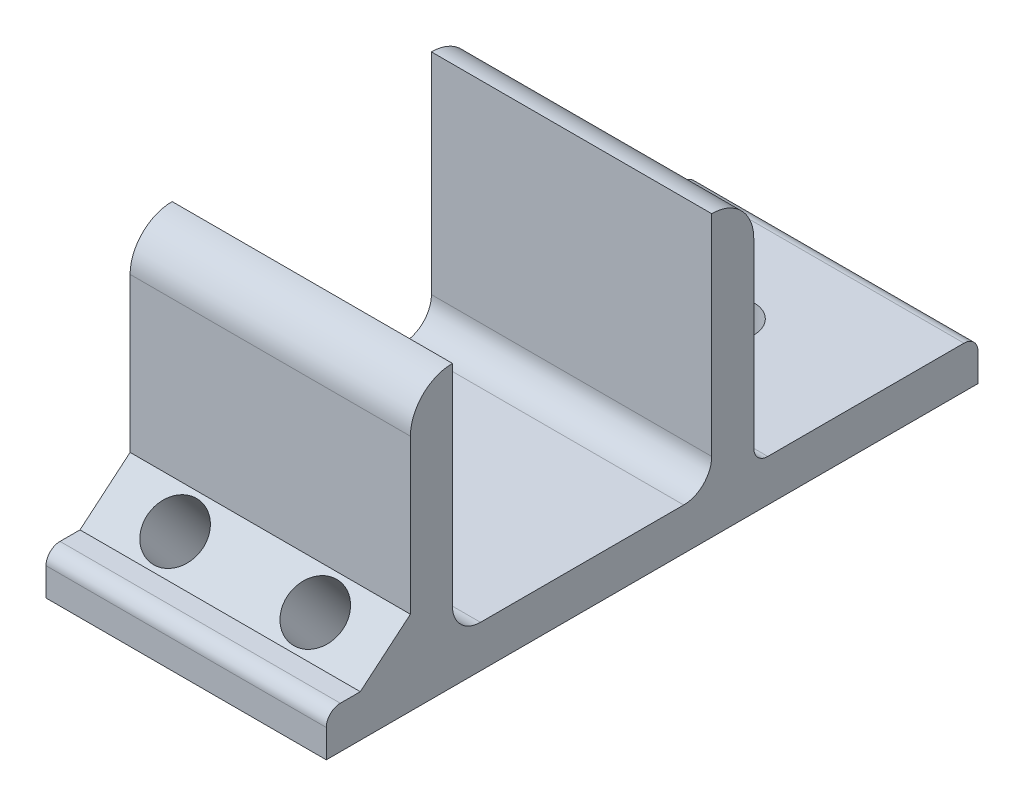
ISO-10303-21;
HEADER;
FILE_DESCRIPTION(('STEP AP214'),'2;1');
FILE_NAME('part.step','',(''),(''),'','','');
FILE_SCHEMA(('AUTOMOTIVE_DESIGN { 1 0 10303 214 1 1 1 1 }'));
ENDSEC;
DATA;
#1=APPLICATION_CONTEXT('core data for automotive mechanical design processes');
#2=APPLICATION_PROTOCOL_DEFINITION('international standard','automotive_design',2000,#1);
#3=PRODUCT_CONTEXT('',#1,'mechanical');
#4=PRODUCT('Part','Part','',(#3));
#5=PRODUCT_RELATED_PRODUCT_CATEGORY('part','',(#4));
#6=PRODUCT_DEFINITION_FORMATION('','',#4);
#7=PRODUCT_DEFINITION_CONTEXT('part definition',#1,'design');
#8=PRODUCT_DEFINITION('design','',#6,#7);
#9=PRODUCT_DEFINITION_SHAPE('','',#8);
#10=(LENGTH_UNIT() NAMED_UNIT(*) SI_UNIT(.MILLI.,.METRE.));
#11=(NAMED_UNIT(*) PLANE_ANGLE_UNIT() SI_UNIT($,.RADIAN.));
#12=(NAMED_UNIT(*) SI_UNIT($,.STERADIAN.) SOLID_ANGLE_UNIT());
#13=UNCERTAINTY_MEASURE_WITH_UNIT(LENGTH_MEASURE(1.E-05),#10,'distance_accuracy_value','');
#14=(GEOMETRIC_REPRESENTATION_CONTEXT(3) GLOBAL_UNCERTAINTY_ASSIGNED_CONTEXT((#13)) GLOBAL_UNIT_ASSIGNED_CONTEXT((#10,
#11,#12)) REPRESENTATION_CONTEXT('',''));
#15=CARTESIAN_POINT('',(0.,0.,0.));
#16=DIRECTION('',(0.,0.,1.));
#17=DIRECTION('',(1.,0.,0.));
#18=AXIS2_PLACEMENT_3D('',#15,#16,#17);
#19=CARTESIAN_POINT('',(20.,0.,18.25));
#20=DIRECTION('',(0.,0.,-1.));
#21=DIRECTION('',(0.,1.,0.));
#22=AXIS2_PLACEMENT_3D('',#19,#20,#21);
#23=PLANE('',#22);
#24=DIRECTION('',(0.,-1.,0.));
#25=VECTOR('',#24,1.);
#26=CARTESIAN_POINT('',(0.,0.,18.25));
#27=LINE('',#26,#25);
#28=CARTESIAN_POINT('',(0.,2.,18.25));
#29=VERTEX_POINT('',#28);
#30=CARTESIAN_POINT('',(0.,0.,18.25));
#31=VERTEX_POINT('',#30);
#32=EDGE_CURVE('E181',#29,#31,#27,.T.);
#33=ORIENTED_EDGE('',*,*,#32,.T.);
#34=DIRECTION('',(-1.,0.,0.));
#35=VECTOR('',#34,1.);
#36=CARTESIAN_POINT('',(20.,0.,18.25));
#37=LINE('',#36,#35);
#38=CARTESIAN_POINT('',(20.,0.,18.25));
#39=VERTEX_POINT('',#38);
#40=EDGE_CURVE('E162',#39,#31,#37,.T.);
#41=ORIENTED_EDGE('',*,*,#40,.F.);
#42=DIRECTION('',(0.,-1.,0.));
#43=VECTOR('',#42,1.);
#44=CARTESIAN_POINT('',(20.,0.,18.25));
#45=LINE('',#44,#43);
#46=CARTESIAN_POINT('',(20.,2.,18.25));
#47=VERTEX_POINT('',#46);
#48=EDGE_CURVE('E169',#47,#39,#45,.T.);
#49=ORIENTED_EDGE('',*,*,#48,.F.);
#50=DIRECTION('',(-1.,0.,0.));
#51=VECTOR('',#50,1.);
#52=CARTESIAN_POINT('',(20.,2.,18.25));
#53=LINE('',#52,#51);
#54=EDGE_CURVE('E227',#47,#29,#53,.T.);
#55=ORIENTED_EDGE('',*,*,#54,.T.);
#56=EDGE_LOOP('',(#33,#41,#49,#55));
#57=FACE_BOUND('',#56,.T.);
#58=ADVANCED_FACE('F33',(#57),#23,.F.);
#59=CARTESIAN_POINT('',(20.,0.,-18.25));
#60=DIRECTION('',(0.,1.,0.));
#61=DIRECTION('',(0.,0.,1.));
#62=AXIS2_PLACEMENT_3D('',#59,#60,#61);
#63=PLANE('',#62);
#64=CARTESIAN_POINT('',(10.,0.,-20.25));
#65=DIRECTION('',(0.,1.,0.));
#66=DIRECTION('',(0.,0.,1.));
#67=AXIS2_PLACEMENT_3D('',#64,#65,#66);
#68=CIRCLE('',#67,2.);
#69=CARTESIAN_POINT('',(10.,0.,-18.25));
#70=VERTEX_POINT('',#69);
#71=EDGE_CURVE('E409',#70,#70,#68,.T.);
#72=ORIENTED_EDGE('',*,*,#71,.T.);
#73=EDGE_LOOP('',(#72));
#74=FACE_BOUND('',#73,.T.);
#75=CARTESIAN_POINT('',(15.,0.,10.2616820485936));
#76=DIRECTION('',(0.,1.,0.));
#77=DIRECTION('',(0.,0.,1.));
#78=AXIS2_PLACEMENT_3D('',#75,#76,#77);
#79=ELLIPSE('',#78,2.61081457866455,2.);
#80=CARTESIAN_POINT('',(15.,0.,12.8724966272582));
#81=VERTEX_POINT('',#80);
#82=EDGE_CURVE('E413',#81,#81,#79,.T.);
#83=ORIENTED_EDGE('',*,*,#82,.T.);
#84=EDGE_LOOP('',(#83));
#85=FACE_BOUND('',#84,.T.);
#86=CARTESIAN_POINT('',(5.,0.,10.2616820485936));
#87=DIRECTION('',(0.,1.,0.));
#88=DIRECTION('',(0.,0.,1.));
#89=AXIS2_PLACEMENT_3D('',#86,#87,#88);
#90=ELLIPSE('',#89,2.61081457866455,2.);
#91=CARTESIAN_POINT('',(5.,0.,12.8724966272582));
#92=VERTEX_POINT('',#91);
#93=EDGE_CURVE('E302',#92,#92,#90,.T.);
#94=ORIENTED_EDGE('',*,*,#93,.T.);
#95=EDGE_LOOP('',(#94));
#96=FACE_BOUND('',#95,.T.);
#97=DIRECTION('',(0.,0.,-1.));
#98=VECTOR('',#97,1.);
#99=CARTESIAN_POINT('',(0.,0.,-18.25));
#100=LINE('',#99,#98);
#101=CARTESIAN_POINT('',(0.,0.,-28.25));
#102=VERTEX_POINT('',#101);
#103=EDGE_CURVE('E269',#31,#102,#100,.T.);
#104=ORIENTED_EDGE('',*,*,#103,.T.);
#105=DIRECTION('',(-1.,0.,0.));
#106=VECTOR('',#105,1.);
#107=CARTESIAN_POINT('',(20.,0.,-28.25));
#108=LINE('',#107,#106);
#109=CARTESIAN_POINT('',(20.,0.,-28.25));
#110=VERTEX_POINT('',#109);
#111=EDGE_CURVE('E165',#110,#102,#108,.T.);
#112=ORIENTED_EDGE('',*,*,#111,.F.);
#113=DIRECTION('',(0.,0.,-1.));
#114=VECTOR('',#113,1.);
#115=CARTESIAN_POINT('',(20.,0.,18.25));
#116=LINE('',#115,#114);
#117=EDGE_CURVE('E158',#39,#110,#116,.T.);
#118=ORIENTED_EDGE('',*,*,#117,.F.);
#119=ORIENTED_EDGE('',*,*,#40,.T.);
#120=EDGE_LOOP('',(#104,#112,#118,#119));
#121=FACE_BOUND('',#120,.T.);
#122=ADVANCED_FACE('F160',(#74,#85,#96,#121),#63,.F.);
#123=CARTESIAN_POINT('',(20.,0.,-28.25));
#124=DIRECTION('',(0.,0.,1.));
#125=DIRECTION('',(1.,0.,0.));
#126=AXIS2_PLACEMENT_3D('',#123,#124,#125);
#127=PLANE('',#126);
#128=DIRECTION('',(0.,1.,0.));
#129=VECTOR('',#128,1.);
#130=CARTESIAN_POINT('',(0.,0.,-28.25));
#131=LINE('',#130,#129);
#132=CARTESIAN_POINT('',(0.,2.,-28.25));
#133=VERTEX_POINT('',#132);
#134=EDGE_CURVE('E263',#102,#133,#131,.T.);
#135=ORIENTED_EDGE('',*,*,#134,.T.);
#136=DIRECTION('',(-1.,0.,0.));
#137=VECTOR('',#136,1.);
#138=CARTESIAN_POINT('',(20.,2.,-28.25));
#139=LINE('',#138,#137);
#140=CARTESIAN_POINT('',(20.,2.,-28.25));
#141=VERTEX_POINT('',#140);
#142=EDGE_CURVE('E187',#141,#133,#139,.T.);
#143=ORIENTED_EDGE('',*,*,#142,.F.);
#144=DIRECTION('',(0.,1.,0.));
#145=VECTOR('',#144,1.);
#146=CARTESIAN_POINT('',(20.,0.,-28.25));
#147=LINE('',#146,#145);
#148=EDGE_CURVE('E168',#110,#141,#147,.T.);
#149=ORIENTED_EDGE('',*,*,#148,.F.);
#150=ORIENTED_EDGE('',*,*,#111,.T.);
#151=EDGE_LOOP('',(#135,#143,#149,#150));
#152=FACE_BOUND('',#151,.T.);
#153=ADVANCED_FACE('F303',(#152),#127,.F.);
#154=CARTESIAN_POINT('',(20.,2.,-27.25));
#155=DIRECTION('',(-1.,0.,0.));
#156=DIRECTION('',(0.,0.,1.));
#157=AXIS2_PLACEMENT_3D('',#154,#155,#156);
#158=CYLINDRICAL_SURFACE('',#157,1.);
#159=CARTESIAN_POINT('',(0.,2.,-27.25));
#160=DIRECTION('',(1.,0.,0.));
#161=DIRECTION('',(0.,0.,-1.));
#162=AXIS2_PLACEMENT_3D('',#159,#160,#161);
#163=CIRCLE('',#162,1.);
#164=CARTESIAN_POINT('',(0.,3.,-27.25));
#165=VERTEX_POINT('',#164);
#166=EDGE_CURVE('E258',#133,#165,#163,.T.);
#167=ORIENTED_EDGE('',*,*,#166,.T.);
#168=DIRECTION('',(-1.,0.,0.));
#169=VECTOR('',#168,1.);
#170=CARTESIAN_POINT('',(20.,3.,-27.25));
#171=LINE('',#170,#169);
#172=CARTESIAN_POINT('',(20.,3.,-27.25));
#173=VERTEX_POINT('',#172);
#174=EDGE_CURVE('E249',#173,#165,#171,.T.);
#175=ORIENTED_EDGE('',*,*,#174,.F.);
#176=CARTESIAN_POINT('',(20.,2.,-27.25));
#177=DIRECTION('',(1.,0.,0.));
#178=DIRECTION('',(0.,0.,-1.));
#179=AXIS2_PLACEMENT_3D('',#176,#177,#178);
#180=CIRCLE('',#179,1.);
#181=EDGE_CURVE('E259',#141,#173,#180,.T.);
#182=ORIENTED_EDGE('',*,*,#181,.F.);
#183=ORIENTED_EDGE('',*,*,#142,.T.);
#184=EDGE_LOOP('',(#167,#175,#182,#183));
#185=FACE_BOUND('',#184,.T.);
#186=ADVANCED_FACE('F256',(#185),#158,.T.);
#187=CARTESIAN_POINT('',(20.,3.,-27.25));
#188=DIRECTION('',(0.,-1.,0.));
#189=DIRECTION('',(0.,0.,-1.));
#190=AXIS2_PLACEMENT_3D('',#187,#188,#189);
#191=PLANE('',#190);
#192=CARTESIAN_POINT('',(10.,3.,-20.25));
#193=DIRECTION('',(0.,1.,0.));
#194=DIRECTION('',(0.,0.,1.));
#195=AXIS2_PLACEMENT_3D('',#192,#193,#194);
#196=CIRCLE('',#195,2.);
#197=CARTESIAN_POINT('',(10.,3.,-18.25));
#198=VERTEX_POINT('',#197);
#199=EDGE_CURVE('E406',#198,#198,#196,.T.);
#200=ORIENTED_EDGE('',*,*,#199,.F.);
#201=EDGE_LOOP('',(#200));
#202=FACE_BOUND('',#201,.T.);
#203=DIRECTION('',(0.,0.,1.));
#204=VECTOR('',#203,1.);
#205=CARTESIAN_POINT('',(0.,3.,-27.25));
#206=LINE('',#205,#204);
#207=CARTESIAN_POINT('',(0.,3.,-13.25));
#208=VERTEX_POINT('',#207);
#209=EDGE_CURVE('E265',#165,#208,#206,.T.);
#210=ORIENTED_EDGE('',*,*,#209,.T.);
#211=DIRECTION('',(-1.,0.,0.));
#212=VECTOR('',#211,1.);
#213=CARTESIAN_POINT('',(20.,3.,-13.25));
#214=LINE('',#213,#212);
#215=CARTESIAN_POINT('',(20.,3.,-13.25));
#216=VERTEX_POINT('',#215);
#217=EDGE_CURVE('E246',#216,#208,#214,.T.);
#218=ORIENTED_EDGE('',*,*,#217,.F.);
#219=DIRECTION('',(0.,0.,1.));
#220=VECTOR('',#219,1.);
#221=CARTESIAN_POINT('',(20.,3.,-27.25));
#222=LINE('',#221,#220);
#223=EDGE_CURVE('E305',#173,#216,#222,.T.);
#224=ORIENTED_EDGE('',*,*,#223,.F.);
#225=ORIENTED_EDGE('',*,*,#174,.T.);
#226=EDGE_LOOP('',(#210,#218,#224,#225));
#227=FACE_BOUND('',#226,.T.);
#228=ADVANCED_FACE('F354',(#202,#227),#191,.F.);
#229=CARTESIAN_POINT('',(20.,4.,-13.25));
#230=DIRECTION('',(-1.,0.,0.));
#231=DIRECTION('',(0.,0.,1.));
#232=AXIS2_PLACEMENT_3D('',#229,#230,#231);
#233=CYLINDRICAL_SURFACE('',#232,1.);
#234=CARTESIAN_POINT('',(0.,4.,-13.25));
#235=DIRECTION('',(-1.,0.,0.));
#236=DIRECTION('',(0.,0.,-1.));
#237=AXIS2_PLACEMENT_3D('',#234,#235,#236);
#238=CIRCLE('',#237,1.);
#239=CARTESIAN_POINT('',(0.,4.,-12.25));
#240=VERTEX_POINT('',#239);
#241=EDGE_CURVE('E267',#208,#240,#238,.T.);
#242=ORIENTED_EDGE('',*,*,#241,.T.);
#243=DIRECTION('',(-1.,0.,0.));
#244=VECTOR('',#243,1.);
#245=CARTESIAN_POINT('',(20.,4.,-12.25));
#246=LINE('',#245,#244);
#247=CARTESIAN_POINT('',(20.,4.,-12.25));
#248=VERTEX_POINT('',#247);
#249=EDGE_CURVE('E243',#248,#240,#246,.T.);
#250=ORIENTED_EDGE('',*,*,#249,.F.);
#251=CARTESIAN_POINT('',(20.,4.,-13.25));
#252=DIRECTION('',(-1.,0.,0.));
#253=DIRECTION('',(0.,0.,-1.));
#254=AXIS2_PLACEMENT_3D('',#251,#252,#253);
#255=CIRCLE('',#254,1.);
#256=EDGE_CURVE('E309',#216,#248,#255,.T.);
#257=ORIENTED_EDGE('',*,*,#256,.F.);
#258=ORIENTED_EDGE('',*,*,#217,.T.);
#259=EDGE_LOOP('',(#242,#250,#257,#258));
#260=FACE_BOUND('',#259,.T.);
#261=ADVANCED_FACE('F357',(#260),#233,.F.);
#262=CARTESIAN_POINT('',(20.,17.,-12.25));
#263=DIRECTION('',(0.,0.,1.));
#264=DIRECTION('',(0.,-1.,0.));
#265=AXIS2_PLACEMENT_3D('',#262,#263,#264);
#266=PLANE('',#265);
#267=DIRECTION('',(0.,1.,0.));
#268=VECTOR('',#267,1.);
#269=CARTESIAN_POINT('',(0.,17.,-12.25));
#270=LINE('',#269,#268);
#271=CARTESIAN_POINT('',(0.,17.,-12.25));
#272=VERTEX_POINT('',#271);
#273=EDGE_CURVE('E274',#240,#272,#270,.T.);
#274=ORIENTED_EDGE('',*,*,#273,.T.);
#275=DIRECTION('',(-1.,0.,0.));
#276=VECTOR('',#275,1.);
#277=CARTESIAN_POINT('',(20.,17.,-12.25));
#278=LINE('',#277,#276);
#279=CARTESIAN_POINT('',(20.,17.,-12.25));
#280=VERTEX_POINT('',#279);
#281=EDGE_CURVE('E240',#280,#272,#278,.T.);
#282=ORIENTED_EDGE('',*,*,#281,.F.);
#283=DIRECTION('',(0.,1.,0.));
#284=VECTOR('',#283,1.);
#285=CARTESIAN_POINT('',(20.,17.,-12.25));
#286=LINE('',#285,#284);
#287=EDGE_CURVE('E311',#248,#280,#286,.T.);
#288=ORIENTED_EDGE('',*,*,#287,.F.);
#289=ORIENTED_EDGE('',*,*,#249,.T.);
#290=EDGE_LOOP('',(#274,#282,#288,#289));
#291=FACE_BOUND('',#290,.T.);
#292=ADVANCED_FACE('F361',(#291),#266,.F.);
#293=CARTESIAN_POINT('',(20.,17.,-9.25));
#294=DIRECTION('',(-1.,0.,0.));
#295=DIRECTION('',(0.,0.,1.));
#296=AXIS2_PLACEMENT_3D('',#293,#294,#295);
#297=CYLINDRICAL_SURFACE('',#296,3.);
#298=CARTESIAN_POINT('',(0.,17.,-9.25));
#299=DIRECTION('',(1.,0.,0.));
#300=DIRECTION('',(0.,0.,1.));
#301=AXIS2_PLACEMENT_3D('',#298,#299,#300);
#302=CIRCLE('',#301,3.);
#303=CARTESIAN_POINT('',(0.,20.,-9.25));
#304=VERTEX_POINT('',#303);
#305=EDGE_CURVE('E276',#272,#304,#302,.T.);
#306=ORIENTED_EDGE('',*,*,#305,.T.);
#307=DIRECTION('',(-1.,0.,0.));
#308=VECTOR('',#307,1.);
#309=CARTESIAN_POINT('',(20.,20.,-9.25));
#310=LINE('',#309,#308);
#311=CARTESIAN_POINT('',(20.,20.,-9.25));
#312=VERTEX_POINT('',#311);
#313=EDGE_CURVE('E237',#312,#304,#310,.T.);
#314=ORIENTED_EDGE('',*,*,#313,.F.);
#315=CARTESIAN_POINT('',(20.,17.,-9.25));
#316=DIRECTION('',(1.,0.,0.));
#317=DIRECTION('',(0.,0.,1.));
#318=AXIS2_PLACEMENT_3D('',#315,#316,#317);
#319=CIRCLE('',#318,3.);
#320=EDGE_CURVE('E313',#280,#312,#319,.T.);
#321=ORIENTED_EDGE('',*,*,#320,.F.);
#322=ORIENTED_EDGE('',*,*,#281,.T.);
#323=EDGE_LOOP('',(#306,#314,#321,#322));
#324=FACE_BOUND('',#323,.T.);
#325=ADVANCED_FACE('F365',(#324),#297,.T.);
#326=CARTESIAN_POINT('',(20.,3.,-9.25000000000001));
#327=DIRECTION('',(0.,0.,-1.));
#328=DIRECTION('',(0.,1.,0.));
#329=AXIS2_PLACEMENT_3D('',#326,#327,#328);
#330=PLANE('',#329);
#331=DIRECTION('',(0.,-1.,0.));
#332=VECTOR('',#331,1.);
#333=CARTESIAN_POINT('',(0.,3.,-9.25000000000001));
#334=LINE('',#333,#332);
#335=CARTESIAN_POINT('',(0.,5.,-9.25000000000001));
#336=VERTEX_POINT('',#335);
#337=EDGE_CURVE('E278',#304,#336,#334,.T.);
#338=ORIENTED_EDGE('',*,*,#337,.T.);
#339=DIRECTION('',(-1.,0.,0.));
#340=VECTOR('',#339,1.);
#341=CARTESIAN_POINT('',(20.,5.,-9.25000000000001));
#342=LINE('',#341,#340);
#343=CARTESIAN_POINT('',(20.,5.,-9.25000000000001));
#344=VERTEX_POINT('',#343);
#345=EDGE_CURVE('E195',#336,#344,#342,.F.);
#346=ORIENTED_EDGE('',*,*,#345,.T.);
#347=DIRECTION('',(0.,-1.,0.));
#348=VECTOR('',#347,1.);
#349=CARTESIAN_POINT('',(20.,3.,-9.25000000000001));
#350=LINE('',#349,#348);
#351=EDGE_CURVE('E315',#312,#344,#350,.T.);
#352=ORIENTED_EDGE('',*,*,#351,.F.);
#353=ORIENTED_EDGE('',*,*,#313,.T.);
#354=EDGE_LOOP('',(#338,#346,#352,#353));
#355=FACE_BOUND('',#354,.T.);
#356=ADVANCED_FACE('F369',(#355),#330,.F.);
#357=CARTESIAN_POINT('',(20.,3.,-9.25000000000001));
#358=DIRECTION('',(0.,-1.,0.));
#359=DIRECTION('',(0.,0.,-1.));
#360=AXIS2_PLACEMENT_3D('',#357,#358,#359);
#361=PLANE('',#360);
#362=DIRECTION('',(0.,0.,1.));
#363=VECTOR('',#362,1.);
#364=CARTESIAN_POINT('',(0.,3.,-9.25000000000001));
#365=LINE('',#364,#363);
#366=CARTESIAN_POINT('',(0.,3.,-7.25000000000001));
#367=VERTEX_POINT('',#366);
#368=CARTESIAN_POINT('',(0.,3.,7.25));
#369=VERTEX_POINT('',#368);
#370=EDGE_CURVE('E281',#367,#369,#365,.T.);
#371=ORIENTED_EDGE('',*,*,#370,.T.);
#372=DIRECTION('',(-1.,0.,0.));
#373=VECTOR('',#372,1.);
#374=CARTESIAN_POINT('',(20.,3.,7.25));
#375=LINE('',#374,#373);
#376=CARTESIAN_POINT('',(20.,3.,7.25));
#377=VERTEX_POINT('',#376);
#378=EDGE_CURVE('E193',#369,#377,#375,.F.);
#379=ORIENTED_EDGE('',*,*,#378,.T.);
#380=DIRECTION('',(0.,0.,1.));
#381=VECTOR('',#380,1.);
#382=CARTESIAN_POINT('',(20.,3.,-9.25000000000001));
#383=LINE('',#382,#381);
#384=CARTESIAN_POINT('',(20.,3.,-7.25000000000001));
#385=VERTEX_POINT('',#384);
#386=EDGE_CURVE('E318',#385,#377,#383,.T.);
#387=ORIENTED_EDGE('',*,*,#386,.F.);
#388=DIRECTION('',(-1.,0.,0.));
#389=VECTOR('',#388,1.);
#390=CARTESIAN_POINT('',(0.,3.,-7.25000000000001));
#391=LINE('',#390,#389);
#392=EDGE_CURVE('E185',#385,#367,#391,.T.);
#393=ORIENTED_EDGE('',*,*,#392,.T.);
#394=EDGE_LOOP('',(#371,#379,#387,#393));
#395=FACE_BOUND('',#394,.T.);
#396=ADVANCED_FACE('F329',(#395),#361,.F.);
#397=CARTESIAN_POINT('',(20.,3.,9.25));
#398=DIRECTION('',(0.,0.,1.));
#399=DIRECTION('',(0.,-1.,0.));
#400=AXIS2_PLACEMENT_3D('',#397,#398,#399);
#401=PLANE('',#400);
#402=DIRECTION('',(0.,1.,0.));
#403=VECTOR('',#402,1.);
#404=CARTESIAN_POINT('',(20.,3.,9.25));
#405=LINE('',#404,#403);
#406=CARTESIAN_POINT('',(20.,5.,9.25));
#407=VERTEX_POINT('',#406);
#408=CARTESIAN_POINT('',(20.,20.,9.25));
#409=VERTEX_POINT('',#408);
#410=EDGE_CURVE('E297',#407,#409,#405,.T.);
#411=ORIENTED_EDGE('',*,*,#410,.F.);
#412=DIRECTION('',(-1.,0.,0.));
#413=VECTOR('',#412,1.);
#414=CARTESIAN_POINT('',(0.,5.,9.25));
#415=LINE('',#414,#413);
#416=CARTESIAN_POINT('',(0.,5.,9.25));
#417=VERTEX_POINT('',#416);
#418=EDGE_CURVE('E182',#407,#417,#415,.T.);
#419=ORIENTED_EDGE('',*,*,#418,.T.);
#420=DIRECTION('',(0.,1.,0.));
#421=VECTOR('',#420,1.);
#422=CARTESIAN_POINT('',(0.,3.,9.25));
#423=LINE('',#422,#421);
#424=CARTESIAN_POINT('',(0.,20.,9.25));
#425=VERTEX_POINT('',#424);
#426=EDGE_CURVE('E284',#417,#425,#423,.T.);
#427=ORIENTED_EDGE('',*,*,#426,.T.);
#428=DIRECTION('',(-1.,0.,0.));
#429=VECTOR('',#428,1.);
#430=CARTESIAN_POINT('',(20.,20.,9.25));
#431=LINE('',#430,#429);
#432=EDGE_CURVE('E234',#409,#425,#431,.T.);
#433=ORIENTED_EDGE('',*,*,#432,.F.);
#434=EDGE_LOOP('',(#411,#419,#427,#433));
#435=FACE_BOUND('',#434,.T.);
#436=ADVANCED_FACE('F324',(#435),#401,.F.);
#437=CARTESIAN_POINT('',(20.,17.,9.25));
#438=DIRECTION('',(-1.,0.,0.));
#439=DIRECTION('',(0.,0.,1.));
#440=AXIS2_PLACEMENT_3D('',#437,#438,#439);
#441=CYLINDRICAL_SURFACE('',#440,3.);
#442=CARTESIAN_POINT('',(0.,17.,9.25));
#443=DIRECTION('',(1.,0.,0.));
#444=DIRECTION('',(0.,0.,-1.));
#445=AXIS2_PLACEMENT_3D('',#442,#443,#444);
#446=CIRCLE('',#445,3.);
#447=CARTESIAN_POINT('',(0.,17.,12.25));
#448=VERTEX_POINT('',#447);
#449=EDGE_CURVE('E223',#425,#448,#446,.T.);
#450=ORIENTED_EDGE('',*,*,#449,.T.);
#451=DIRECTION('',(-1.,0.,0.));
#452=VECTOR('',#451,1.);
#453=CARTESIAN_POINT('',(20.,17.,12.25));
#454=LINE('',#453,#452);
#455=CARTESIAN_POINT('',(20.,17.,12.25));
#456=VERTEX_POINT('',#455);
#457=EDGE_CURVE('E231',#456,#448,#454,.T.);
#458=ORIENTED_EDGE('',*,*,#457,.F.);
#459=CARTESIAN_POINT('',(20.,17.,9.25));
#460=DIRECTION('',(1.,0.,0.));
#461=DIRECTION('',(0.,0.,-1.));
#462=AXIS2_PLACEMENT_3D('',#459,#460,#461);
#463=CIRCLE('',#462,3.);
#464=EDGE_CURVE('E294',#409,#456,#463,.T.);
#465=ORIENTED_EDGE('',*,*,#464,.F.);
#466=ORIENTED_EDGE('',*,*,#432,.T.);
#467=EDGE_LOOP('',(#450,#458,#465,#466));
#468=FACE_BOUND('',#467,.T.);
#469=ADVANCED_FACE('F288',(#468),#441,.T.);
#470=CARTESIAN_POINT('',(20.,17.,12.25));
#471=DIRECTION('',(0.,0.,-1.));
#472=DIRECTION('',(0.,1.,0.));
#473=AXIS2_PLACEMENT_3D('',#470,#471,#472);
#474=PLANE('',#473);
#475=DIRECTION('',(0.,-1.,0.));
#476=VECTOR('',#475,1.);
#477=CARTESIAN_POINT('',(0.,17.,12.25));
#478=LINE('',#477,#476);
#479=CARTESIAN_POINT('',(0.,5.99999999999999,12.25));
#480=VERTEX_POINT('',#479);
#481=EDGE_CURVE('E220',#448,#480,#478,.T.);
#482=ORIENTED_EDGE('',*,*,#481,.T.);
#483=DIRECTION('',(1.,0.,0.));
#484=VECTOR('',#483,1.);
#485=CARTESIAN_POINT('',(20.,5.99999999999999,12.25));
#486=LINE('',#485,#484);
#487=CARTESIAN_POINT('',(20.,5.99999999999999,12.25));
#488=VERTEX_POINT('',#487);
#489=EDGE_CURVE('E48',#480,#488,#486,.T.);
#490=ORIENTED_EDGE('',*,*,#489,.T.);
#491=DIRECTION('',(0.,-1.,0.));
#492=VECTOR('',#491,1.);
#493=CARTESIAN_POINT('',(20.,17.,12.25));
#494=LINE('',#493,#492);
#495=EDGE_CURVE('E293',#456,#488,#494,.T.);
#496=ORIENTED_EDGE('',*,*,#495,.F.);
#497=ORIENTED_EDGE('',*,*,#457,.T.);
#498=EDGE_LOOP('',(#482,#490,#496,#497));
#499=FACE_BOUND('',#498,.T.);
#500=ADVANCED_FACE('F292',(#499),#474,.F.);
#501=CARTESIAN_POINT('',(20.,3.,17.25));
#502=DIRECTION('',(0.,-1.,0.));
#503=DIRECTION('',(0.,0.,-1.));
#504=AXIS2_PLACEMENT_3D('',#501,#502,#503);
#505=PLANE('',#504);
#506=DIRECTION('',(0.,0.,1.));
#507=VECTOR('',#506,1.);
#508=CARTESIAN_POINT('',(20.,3.,17.25));
#509=LINE('',#508,#507);
#510=CARTESIAN_POINT('',(20.,3.,15.8252607777827));
#511=VERTEX_POINT('',#510);
#512=CARTESIAN_POINT('',(20.,3.,17.25));
#513=VERTEX_POINT('',#512);
#514=EDGE_CURVE('E215',#511,#513,#509,.T.);
#515=ORIENTED_EDGE('',*,*,#514,.F.);
#516=DIRECTION('',(-1.,0.,0.));
#517=VECTOR('',#516,1.);
#518=CARTESIAN_POINT('',(0.,3.,15.8252607777827));
#519=LINE('',#518,#517);
#520=CARTESIAN_POINT('',(0.,3.,15.8252607777827));
#521=VERTEX_POINT('',#520);
#522=EDGE_CURVE('E205',#511,#521,#519,.T.);
#523=ORIENTED_EDGE('',*,*,#522,.T.);
#524=DIRECTION('',(0.,0.,1.));
#525=VECTOR('',#524,1.);
#526=CARTESIAN_POINT('',(0.,3.,17.25));
#527=LINE('',#526,#525);
#528=CARTESIAN_POINT('',(0.,3.,17.25));
#529=VERTEX_POINT('',#528);
#530=EDGE_CURVE('E213',#521,#529,#527,.T.);
#531=ORIENTED_EDGE('',*,*,#530,.T.);
#532=DIRECTION('',(-1.,0.,0.));
#533=VECTOR('',#532,1.);
#534=CARTESIAN_POINT('',(20.,3.,17.25));
#535=LINE('',#534,#533);
#536=EDGE_CURVE('E229',#513,#529,#535,.T.);
#537=ORIENTED_EDGE('',*,*,#536,.F.);
#538=EDGE_LOOP('',(#515,#523,#531,#537));
#539=FACE_BOUND('',#538,.T.);
#540=ADVANCED_FACE('F211',(#539),#505,.F.);
#541=CARTESIAN_POINT('',(20.,2.,17.25));
#542=DIRECTION('',(-1.,0.,0.));
#543=DIRECTION('',(0.,0.,1.));
#544=AXIS2_PLACEMENT_3D('',#541,#542,#543);
#545=CYLINDRICAL_SURFACE('',#544,0.999999999999999);
#546=CARTESIAN_POINT('',(0.,2.,17.25));
#547=DIRECTION('',(1.,0.,0.));
#548=DIRECTION('',(0.,0.,1.));
#549=AXIS2_PLACEMENT_3D('',#546,#547,#548);
#550=CIRCLE('',#549,0.999999999999999);
#551=EDGE_CURVE('E178',#529,#29,#550,.T.);
#552=ORIENTED_EDGE('',*,*,#551,.T.);
#553=ORIENTED_EDGE('',*,*,#54,.F.);
#554=CARTESIAN_POINT('',(20.,2.,17.25));
#555=DIRECTION('',(1.,0.,0.));
#556=DIRECTION('',(0.,0.,1.));
#557=AXIS2_PLACEMENT_3D('',#554,#555,#556);
#558=CIRCLE('',#557,0.999999999999999);
#559=EDGE_CURVE('E174',#513,#47,#558,.T.);
#560=ORIENTED_EDGE('',*,*,#559,.F.);
#561=ORIENTED_EDGE('',*,*,#536,.T.);
#562=EDGE_LOOP('',(#552,#553,#560,#561));
#563=FACE_BOUND('',#562,.T.);
#564=ADVANCED_FACE('F384',(#563),#545,.T.);
#565=CARTESIAN_POINT('',(20.,2.,17.25));
#566=DIRECTION('',(-1.,0.,0.));
#567=DIRECTION('',(0.,0.,1.));
#568=AXIS2_PLACEMENT_3D('',#565,#566,#567);
#569=PLANE('',#568);
#570=ORIENTED_EDGE('',*,*,#48,.T.);
#571=ORIENTED_EDGE('',*,*,#117,.T.);
#572=ORIENTED_EDGE('',*,*,#148,.T.);
#573=ORIENTED_EDGE('',*,*,#181,.T.);
#574=ORIENTED_EDGE('',*,*,#223,.T.);
#575=ORIENTED_EDGE('',*,*,#256,.T.);
#576=ORIENTED_EDGE('',*,*,#287,.T.);
#577=ORIENTED_EDGE('',*,*,#320,.T.);
#578=ORIENTED_EDGE('',*,*,#351,.T.);
#579=CARTESIAN_POINT('',(20.,5.,-7.25000000000001));
#580=DIRECTION('',(-1.,0.,0.));
#581=DIRECTION('',(0.,0.,1.));
#582=AXIS2_PLACEMENT_3D('',#579,#580,#581);
#583=CIRCLE('',#582,2.);
#584=EDGE_CURVE('E203',#344,#385,#583,.T.);
#585=ORIENTED_EDGE('',*,*,#584,.T.);
#586=ORIENTED_EDGE('',*,*,#386,.T.);
#587=CARTESIAN_POINT('',(20.,5.,7.25));
#588=DIRECTION('',(-1.,0.,0.));
#589=DIRECTION('',(0.,0.,1.));
#590=AXIS2_PLACEMENT_3D('',#587,#588,#589);
#591=CIRCLE('',#590,2.);
#592=EDGE_CURVE('E199',#377,#407,#591,.T.);
#593=ORIENTED_EDGE('',*,*,#592,.T.);
#594=ORIENTED_EDGE('',*,*,#410,.T.);
#595=ORIENTED_EDGE('',*,*,#464,.T.);
#596=ORIENTED_EDGE('',*,*,#495,.T.);
#597=DIRECTION('',(0.,0.642787609686535,-0.766044443118982));
#598=VECTOR('',#597,1.);
#599=CARTESIAN_POINT('',(20.,1.88527697280337,17.1537359501918));
#600=LINE('',#599,#598);
#601=EDGE_CURVE('E11',#488,#511,#600,.F.);
#602=ORIENTED_EDGE('',*,*,#601,.T.);
#603=ORIENTED_EDGE('',*,*,#514,.T.);
#604=ORIENTED_EDGE('',*,*,#559,.T.);
#605=EDGE_LOOP('',(#570,#571,#572,#573,#574,#575,#576,#577,#578,#585,#586,#593,#594,#595,#596,
#602,#603,#604));
#606=FACE_BOUND('',#605,.T.);
#607=ADVANCED_FACE('F172',(#606),#569,.F.);
#608=CARTESIAN_POINT('',(0.,2.,17.25));
#609=DIRECTION('',(-1.,0.,0.));
#610=DIRECTION('',(0.,0.,1.));
#611=AXIS2_PLACEMENT_3D('',#608,#609,#610);
#612=PLANE('',#611);
#613=ORIENTED_EDGE('',*,*,#32,.F.);
#614=ORIENTED_EDGE('',*,*,#551,.F.);
#615=ORIENTED_EDGE('',*,*,#530,.F.);
#616=DIRECTION('',(0.,-0.642787609686535,0.766044443118982));
#617=VECTOR('',#616,1.);
#618=CARTESIAN_POINT('',(0.,3.,15.8252607777827));
#619=LINE('',#618,#617);
#620=EDGE_CURVE('E41',#521,#480,#619,.F.);
#621=ORIENTED_EDGE('',*,*,#620,.T.);
#622=ORIENTED_EDGE('',*,*,#481,.F.);
#623=ORIENTED_EDGE('',*,*,#449,.F.);
#624=ORIENTED_EDGE('',*,*,#426,.F.);
#625=CARTESIAN_POINT('',(0.,5.,7.25));
#626=DIRECTION('',(-1.,0.,0.));
#627=DIRECTION('',(0.,0.,1.));
#628=AXIS2_PLACEMENT_3D('',#625,#626,#627);
#629=CIRCLE('',#628,2.);
#630=EDGE_CURVE('E197',#417,#369,#629,.F.);
#631=ORIENTED_EDGE('',*,*,#630,.T.);
#632=ORIENTED_EDGE('',*,*,#370,.F.);
#633=CARTESIAN_POINT('',(0.,5.,-7.25000000000001));
#634=DIRECTION('',(-1.,0.,0.));
#635=DIRECTION('',(0.,0.,1.));
#636=AXIS2_PLACEMENT_3D('',#633,#634,#635);
#637=CIRCLE('',#636,2.);
#638=EDGE_CURVE('E201',#367,#336,#637,.F.);
#639=ORIENTED_EDGE('',*,*,#638,.T.);
#640=ORIENTED_EDGE('',*,*,#337,.F.);
#641=ORIENTED_EDGE('',*,*,#305,.F.);
#642=ORIENTED_EDGE('',*,*,#273,.F.);
#643=ORIENTED_EDGE('',*,*,#241,.F.);
#644=ORIENTED_EDGE('',*,*,#209,.F.);
#645=ORIENTED_EDGE('',*,*,#166,.F.);
#646=ORIENTED_EDGE('',*,*,#134,.F.);
#647=ORIENTED_EDGE('',*,*,#103,.F.);
#648=EDGE_LOOP('',(#613,#614,#615,#621,#622,#623,#624,#631,#632,#639,#640,#641,#642,#643,#644,
#645,#646,#647));
#649=FACE_BOUND('',#648,.T.);
#650=ADVANCED_FACE('F219',(#649),#612,.T.);
#651=CARTESIAN_POINT('',(20.,5.,7.25));
#652=DIRECTION('',(1.,0.,0.));
#653=DIRECTION('',(0.,0.,-1.));
#654=AXIS2_PLACEMENT_3D('',#651,#652,#653);
#655=CYLINDRICAL_SURFACE('',#654,2.);
#656=ORIENTED_EDGE('',*,*,#592,.F.);
#657=ORIENTED_EDGE('',*,*,#378,.F.);
#658=ORIENTED_EDGE('',*,*,#630,.F.);
#659=ORIENTED_EDGE('',*,*,#418,.F.);
#660=EDGE_LOOP('',(#656,#657,#658,#659));
#661=FACE_BOUND('',#660,.T.);
#662=ADVANCED_FACE('F332',(#661),#655,.F.);
#663=CARTESIAN_POINT('',(20.,5.,-7.25000000000001));
#664=DIRECTION('',(1.,0.,0.));
#665=DIRECTION('',(0.,0.,-1.));
#666=AXIS2_PLACEMENT_3D('',#663,#664,#665);
#667=CYLINDRICAL_SURFACE('',#666,2.);
#668=ORIENTED_EDGE('',*,*,#584,.F.);
#669=ORIENTED_EDGE('',*,*,#345,.F.);
#670=ORIENTED_EDGE('',*,*,#638,.F.);
#671=ORIENTED_EDGE('',*,*,#392,.F.);
#672=EDGE_LOOP('',(#668,#669,#670,#671));
#673=FACE_BOUND('',#672,.T.);
#674=ADVANCED_FACE('F334',(#673),#667,.F.);
#675=CARTESIAN_POINT('',(20.,3.,15.8252607777827));
#676=DIRECTION('',(0.,0.766044443118982,0.642787609686535));
#677=DIRECTION('',(1.,0.,0.));
#678=AXIS2_PLACEMENT_3D('',#675,#676,#677);
#679=PLANE('',#678);
#680=CARTESIAN_POINT('',(15.,4.5,14.0376303888913));
#681=DIRECTION('',(0.,0.766044443118982,0.642787609686535));
#682=DIRECTION('',(0.,0.642787609686535,-0.766044443118982));
#683=AXIS2_PLACEMENT_3D('',#680,#681,#682);
#684=CIRCLE('',#683,2.);
#685=CARTESIAN_POINT('',(15.,5.78557521937307,12.5055415026534));
#686=VERTEX_POINT('',#685);
#687=EDGE_CURVE('E410',#686,#686,#684,.T.);
#688=ORIENTED_EDGE('',*,*,#687,.F.);
#689=EDGE_LOOP('',(#688));
#690=FACE_BOUND('',#689,.T.);
#691=CARTESIAN_POINT('',(5.,4.49999999999999,14.0376303888913));
#692=DIRECTION('',(0.,0.766044443118982,0.642787609686535));
#693=DIRECTION('',(0.,-0.642787609686535,0.766044443118982));
#694=AXIS2_PLACEMENT_3D('',#691,#692,#693);
#695=CIRCLE('',#694,2.);
#696=CARTESIAN_POINT('',(5.,3.21442478062692,15.5697192751293));
#697=VERTEX_POINT('',#696);
#698=EDGE_CURVE('E419',#697,#697,#695,.T.);
#699=ORIENTED_EDGE('',*,*,#698,.F.);
#700=EDGE_LOOP('',(#699));
#701=FACE_BOUND('',#700,.T.);
#702=ORIENTED_EDGE('',*,*,#601,.F.);
#703=ORIENTED_EDGE('',*,*,#489,.F.);
#704=ORIENTED_EDGE('',*,*,#620,.F.);
#705=ORIENTED_EDGE('',*,*,#522,.F.);
#706=EDGE_LOOP('',(#702,#703,#704,#705));
#707=FACE_BOUND('',#706,.T.);
#708=ADVANCED_FACE('F35',(#690,#701,#707),#679,.T.);
#709=CARTESIAN_POINT('',(5.,-18.963301531498,-5.65041727238973));
#710=DIRECTION('',(0.,0.766044443118982,0.642787609686535));
#711=DIRECTION('',(0.,-0.642787609686535,0.766044443118982));
#712=AXIS2_PLACEMENT_3D('',#709,#710,#711);
#713=CYLINDRICAL_SURFACE('',#712,2.);
#714=ORIENTED_EDGE('',*,*,#698,.T.);
#715=EDGE_LOOP('',(#714));
#716=FACE_BOUND('',#715,.T.);
#717=ORIENTED_EDGE('',*,*,#93,.F.);
#718=EDGE_LOOP('',(#717));
#719=FACE_BOUND('',#718,.T.);
#720=ADVANCED_FACE('F390',(#716,#719),#713,.F.);
#721=CARTESIAN_POINT('',(15.,-18.963301531498,-5.65041727238973));
#722=DIRECTION('',(0.,0.766044443118982,0.642787609686535));
#723=DIRECTION('',(0.,-0.642787609686535,0.766044443118982));
#724=AXIS2_PLACEMENT_3D('',#721,#722,#723);
#725=CYLINDRICAL_SURFACE('',#724,2.);
#726=ORIENTED_EDGE('',*,*,#687,.T.);
#727=EDGE_LOOP('',(#726));
#728=FACE_BOUND('',#727,.T.);
#729=ORIENTED_EDGE('',*,*,#82,.F.);
#730=EDGE_LOOP('',(#729));
#731=FACE_BOUND('',#730,.T.);
#732=ADVANCED_FACE('F393',(#728,#731),#725,.F.);
#733=CARTESIAN_POINT('',(10.,-7.,-20.25));
#734=DIRECTION('',(0.,1.,0.));
#735=DIRECTION('',(0.,0.,1.));
#736=AXIS2_PLACEMENT_3D('',#733,#734,#735);
#737=CYLINDRICAL_SURFACE('',#736,2.);
#738=ORIENTED_EDGE('',*,*,#199,.T.);
#739=EDGE_LOOP('',(#738));
#740=FACE_BOUND('',#739,.T.);
#741=ORIENTED_EDGE('',*,*,#71,.F.);
#742=EDGE_LOOP('',(#741));
#743=FACE_BOUND('',#742,.T.);
#744=ADVANCED_FACE('F397',(#740,#743),#737,.F.);
#745=CLOSED_SHELL('',(#58,#122,#153,#186,#228,#261,#292,#325,#356,#396,#436,#469,#500,#540,#564,
#607,#650,#662,#674,#708,#720,#732,#744));
#746=MANIFOLD_SOLID_BREP('B2',#745);
#747=ADVANCED_BREP_SHAPE_REPRESENTATION('',(#18,#746),#14);
#748=SHAPE_DEFINITION_REPRESENTATION(#9,#747);
ENDSEC;
END-ISO-10303-21;
